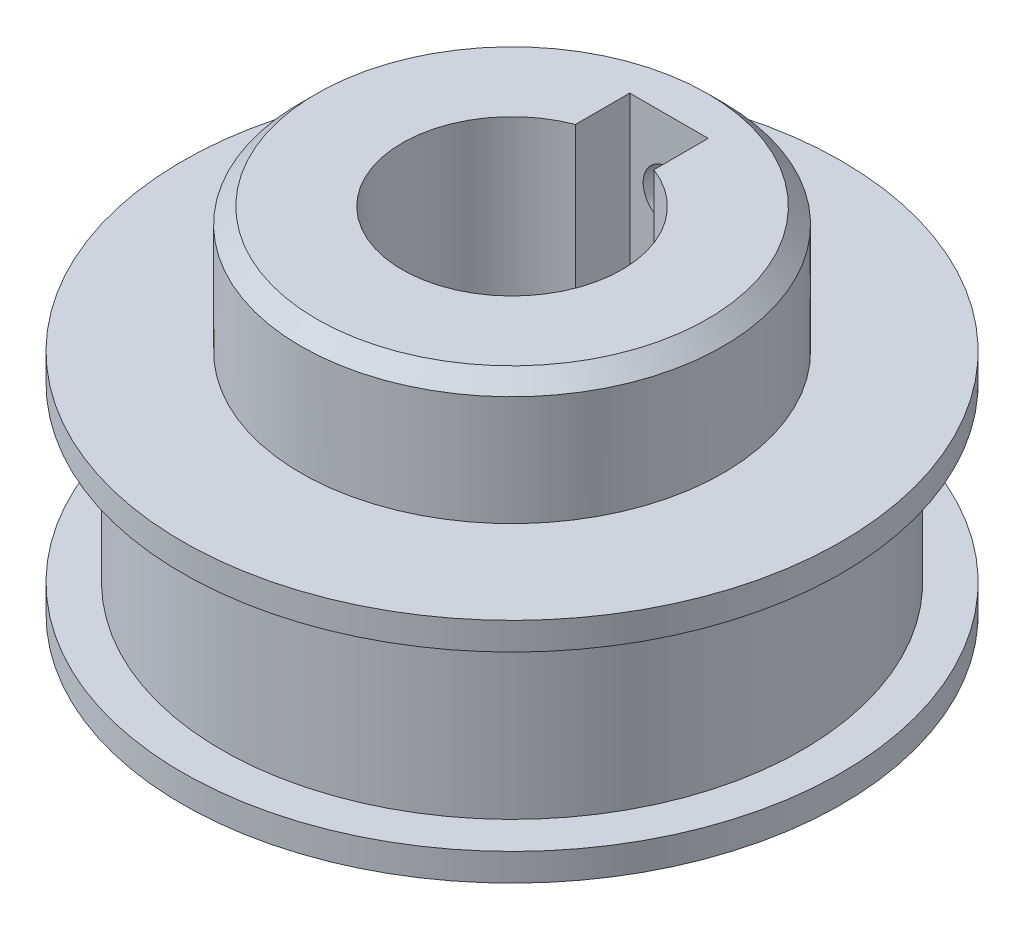
ISO-10303-21;
HEADER;
FILE_DESCRIPTION(('STEP AP214'),'2;1');
FILE_NAME('part.step','',(''),(''),'','','');
FILE_SCHEMA(('AUTOMOTIVE_DESIGN { 1 0 10303 214 1 1 1 1 }'));
ENDSEC;
DATA;
#1=APPLICATION_CONTEXT('core data for automotive mechanical design processes');
#2=APPLICATION_PROTOCOL_DEFINITION('international standard','automotive_design',2000,#1);
#3=PRODUCT_CONTEXT('',#1,'mechanical');
#4=PRODUCT('Part','Part','',(#3));
#5=PRODUCT_RELATED_PRODUCT_CATEGORY('part','',(#4));
#6=PRODUCT_DEFINITION_FORMATION('','',#4);
#7=PRODUCT_DEFINITION_CONTEXT('part definition',#1,'design');
#8=PRODUCT_DEFINITION('design','',#6,#7);
#9=PRODUCT_DEFINITION_SHAPE('','',#8);
#10=(LENGTH_UNIT() NAMED_UNIT(*) SI_UNIT(.MILLI.,.METRE.));
#11=(NAMED_UNIT(*) PLANE_ANGLE_UNIT() SI_UNIT($,.RADIAN.));
#12=(NAMED_UNIT(*) SI_UNIT($,.STERADIAN.) SOLID_ANGLE_UNIT());
#13=UNCERTAINTY_MEASURE_WITH_UNIT(LENGTH_MEASURE(1.E-05),#10,'distance_accuracy_value','');
#14=(GEOMETRIC_REPRESENTATION_CONTEXT(3) GLOBAL_UNCERTAINTY_ASSIGNED_CONTEXT((#13)) GLOBAL_UNIT_ASSIGNED_CONTEXT((#10,
#11,#12)) REPRESENTATION_CONTEXT('',''));
#15=CARTESIAN_POINT('',(0.,0.,0.));
#16=DIRECTION('',(0.,0.,1.));
#17=DIRECTION('',(1.,0.,0.));
#18=AXIS2_PLACEMENT_3D('',#15,#16,#17);
#19=CARTESIAN_POINT('',(0.,11.25,0.));
#20=DIRECTION('',(0.,1.,0.));
#21=DIRECTION('',(0.,0.,1.));
#22=AXIS2_PLACEMENT_3D('',#19,#20,#21);
#23=PLANE('',#22);
#24=DIRECTION('',(0.,0.,1.));
#25=VECTOR('',#24,1.);
#26=CARTESIAN_POINT('',(-2.5,11.25,-4.));
#27=LINE('',#26,#25);
#28=CARTESIAN_POINT('',(-2.5,11.25,-10.));
#29=VERTEX_POINT('',#28);
#30=CARTESIAN_POINT('',(-2.5,11.25,-6.53834841531101));
#31=VERTEX_POINT('',#30);
#32=EDGE_CURVE('E111',#29,#31,#27,.T.);
#33=ORIENTED_EDGE('',*,*,#32,.F.);
#34=DIRECTION('',(-1.,0.,0.));
#35=VECTOR('',#34,1.);
#36=CARTESIAN_POINT('',(2.5,11.25,-10.));
#37=LINE('',#36,#35);
#38=CARTESIAN_POINT('',(2.5,11.25,-10.));
#39=VERTEX_POINT('',#38);
#40=EDGE_CURVE('E108',#39,#29,#37,.T.);
#41=ORIENTED_EDGE('',*,*,#40,.F.);
#42=DIRECTION('',(0.,0.,-1.));
#43=VECTOR('',#42,1.);
#44=CARTESIAN_POINT('',(2.5,11.25,-4.));
#45=LINE('',#44,#43);
#46=CARTESIAN_POINT('',(2.5,11.25,-6.53834841531101));
#47=VERTEX_POINT('',#46);
#48=EDGE_CURVE('E85',#47,#39,#45,.T.);
#49=ORIENTED_EDGE('',*,*,#48,.F.);
#50=CARTESIAN_POINT('',(0.,11.25,0.));
#51=DIRECTION('',(0.,1.,0.));
#52=DIRECTION('',(0.,0.,1.));
#53=AXIS2_PLACEMENT_3D('',#50,#51,#52);
#54=CIRCLE('',#53,7.);
#55=EDGE_CURVE('E123',#31,#47,#54,.T.);
#56=ORIENTED_EDGE('',*,*,#55,.F.);
#57=EDGE_LOOP('',(#33,#41,#49,#56));
#58=FACE_BOUND('',#57,.T.);
#59=CARTESIAN_POINT('',(0.,11.25,0.));
#60=DIRECTION('',(0.,1.,0.));
#61=DIRECTION('',(0.,0.,1.));
#62=AXIS2_PLACEMENT_3D('',#59,#60,#61);
#63=CIRCLE('',#62,12.45);
#64=CARTESIAN_POINT('',(0.,11.25,12.45));
#65=VERTEX_POINT('',#64);
#66=EDGE_CURVE('E188',#65,#65,#63,.T.);
#67=ORIENTED_EDGE('',*,*,#66,.T.);
#68=EDGE_LOOP('',(#67));
#69=FACE_BOUND('',#68,.T.);
#70=ADVANCED_FACE('F40',(#58,#69),#23,.T.);
#71=CARTESIAN_POINT('',(0.,-12.375,0.));
#72=DIRECTION('',(0.,-1.,0.));
#73=DIRECTION('',(0.,0.,-1.));
#74=AXIS2_PLACEMENT_3D('',#71,#72,#73);
#75=CYLINDRICAL_SURFACE('',#74,13.45);
#76=CARTESIAN_POINT('',(0.,8.4,-13.45));
#77=CARTESIAN_POINT('',(0.0923092606846522,8.39999606989156,-13.4499987318262));
#78=CARTESIAN_POINT('',(0.184676546565116,8.39222752254949,-13.4490396601292));
#79=CARTESIAN_POINT('',(0.366841822033255,8.36135934683921,-13.4453059823572));
#80=CARTESIAN_POINT('',(0.456637010359747,8.33824362017226,-13.4425294699356));
#81=CARTESIAN_POINT('',(0.630994428152322,8.27737154568672,-13.4354737642154));
#82=CARTESIAN_POINT('',(0.715560099781557,8.23962494971325,-13.4311955720033));
#83=CARTESIAN_POINT('',(0.877140082819454,8.15058371541106,-13.4216125888811));
#84=CARTESIAN_POINT('',(0.954155707326011,8.09929143868824,-13.4163079769639));
#85=CARTESIAN_POINT('',(1.09887473843124,7.98432350451151,-13.4052331083348));
#86=CARTESIAN_POINT('',(1.16653227898811,7.92059030725544,-13.3994607638233));
#87=CARTESIAN_POINT('',(1.29021965720093,7.78267316407076,-13.3881178862387));
#88=CARTESIAN_POINT('',(1.3462489080705,7.7084886910672,-13.3825473633617));
#89=CARTESIAN_POINT('',(1.44525931032078,7.55147777239056,-13.3722182299544));
#90=CARTESIAN_POINT('',(1.48819762643743,7.4686241229816,-13.3674623066793));
#91=CARTESIAN_POINT('',(1.55953374744784,7.29681393267107,-13.3593282504242));
#92=CARTESIAN_POINT('',(1.58793208386536,7.20785761499358,-13.3559500670804));
#93=CARTESIAN_POINT('',(1.62924305851266,7.02684254400976,-13.3509738304528));
#94=CARTESIAN_POINT('',(1.64223302212707,6.93480168630368,-13.3493668912592));
#95=CARTESIAN_POINT('',(1.65259776008657,6.74983340414768,-13.3480878588677));
#96=CARTESIAN_POINT('',(1.64997314003763,6.65690601422117,-13.3484156906304));
#97=CARTESIAN_POINT('',(1.62924671453376,6.47334082873499,-13.3509610283831));
#98=CARTESIAN_POINT('',(1.61123000940919,6.3826932599305,-13.3531681438955));
#99=CARTESIAN_POINT('',(1.56036358203791,6.20571796726024,-13.3592071549006));
#100=CARTESIAN_POINT('',(1.52751356938961,6.11939032800538,-13.3630390822031));
#101=CARTESIAN_POINT('',(1.44782129743991,5.95324059148484,-13.3719077551923));
#102=CARTESIAN_POINT('',(1.40094197823018,5.8734364465625,-13.3769476848372));
#103=CARTESIAN_POINT('',(1.29454834829898,5.72279573680187,-13.387662006051));
#104=CARTESIAN_POINT('',(1.23503348084826,5.65195956731714,-13.3933364255707));
#105=CARTESIAN_POINT('',(1.10458615859966,5.52077157990349,-13.4047265640634));
#106=CARTESIAN_POINT('',(1.03358033713523,5.46049269247193,-13.4104423065102));
#107=CARTESIAN_POINT('',(0.882419530715335,5.35269795321998,-13.421235697483));
#108=CARTESIAN_POINT('',(0.802264525964526,5.30518212901474,-13.4263133446283));
#109=CARTESIAN_POINT('',(0.635024999510896,5.22426256591315,-13.4352614196214));
#110=CARTESIAN_POINT('',(0.547938289333149,5.19086330506102,-13.4391314642928));
#111=CARTESIAN_POINT('',(0.3693346923303,5.13918239287224,-13.4452247727249));
#112=CARTESIAN_POINT('',(0.277818005423388,5.12090006000337,-13.4474481107253));
#113=CARTESIAN_POINT('',(0.0935829703302501,5.10006629118723,-13.4499878579134));
#114=CARTESIAN_POINT('',(0.000876146276728533,5.09741437220646,-13.4503164475478));
#115=CARTESIAN_POINT('',(-0.183660609696694,5.10765166184763,-13.4490625385916));
#116=CARTESIAN_POINT('',(-0.275490559549179,5.12054055196202,-13.4474800791678));
#117=CARTESIAN_POINT('',(-0.455371019516503,5.16141012686836,-13.4425894893476));
#118=CARTESIAN_POINT('',(-0.543432556703835,5.18934298804758,-13.4392868284265));
#119=CARTESIAN_POINT('',(-0.713621209965722,5.25945793163178,-13.4313256660794));
#120=CARTESIAN_POINT('',(-0.795748131212371,5.301640481583,-13.4266671201659));
#121=CARTESIAN_POINT('',(-0.952185601351656,5.39930112738369,-13.4164833637743));
#122=CARTESIAN_POINT('',(-1.02645523001572,5.45484432614539,-13.4109539568387));
#123=CARTESIAN_POINT('',(-1.16465376419515,5.57755737276608,-13.3996603848827));
#124=CARTESIAN_POINT('',(-1.2285822747215,5.64472766453039,-13.3938962109055));
#125=CARTESIAN_POINT('',(-1.34463961437588,5.78923038063816,-13.3827452759908));
#126=CARTESIAN_POINT('',(-1.39670190188454,5.86661644582719,-13.377360754952));
#127=CARTESIAN_POINT('',(-1.48708947309349,6.0290932732003,-13.3676153586065));
#128=CARTESIAN_POINT('',(-1.52541502358073,6.11418388571093,-13.3632544634201));
#129=CARTESIAN_POINT('',(-1.58713309499605,6.2894383202972,-13.3560652169377));
#130=CARTESIAN_POINT('',(-1.61056334369739,6.37958869058734,-13.3532329964891));
#131=CARTESIAN_POINT('',(-1.64194730698151,6.56258116743755,-13.3494105895796));
#132=CARTESIAN_POINT('',(-1.64990171292012,6.65542315356641,-13.3484203208328));
#133=CARTESIAN_POINT('',(-1.65009582779569,6.84050149096557,-13.3483962729262));
#134=CARTESIAN_POINT('',(-1.64244007353199,6.93273774839408,-13.3493494788668));
#135=CARTESIAN_POINT('',(-1.61185233199219,7.11460212713943,-13.3530770204912));
#136=CARTESIAN_POINT('',(-1.58892034124114,7.20423024786299,-13.3558513565892));
#137=CARTESIAN_POINT('',(-1.52846338782943,7.37832168451034,-13.3629045779662));
#138=CARTESIAN_POINT('',(-1.49094326479907,7.46278670255674,-13.3671829642298));
#139=CARTESIAN_POINT('',(-1.40238541414801,7.62423855105335,-13.3767630641329));
#140=CARTESIAN_POINT('',(-1.35134754184961,7.70122530145313,-13.3820647887248));
#141=CARTESIAN_POINT('',(-1.23681455747847,7.8460698163772,-13.3931367411319));
#142=CARTESIAN_POINT('',(-1.17324151661805,7.91386575090879,-13.3989097601505));
#143=CARTESIAN_POINT('',(-1.03560482830966,8.03786788561699,-13.4102490819286));
#144=CARTESIAN_POINT('',(-0.961538707336214,8.09407134541484,-13.4158153355559));
#145=CARTESIAN_POINT('',(-0.804707912187814,8.19346753605082,-13.4261363991204));
#146=CARTESIAN_POINT('',(-0.721912336762905,8.23661180141906,-13.4308881586852));
#147=CARTESIAN_POINT('',(-0.550239848962248,8.30832314807712,-13.4390137556234));
#148=CARTESIAN_POINT('',(-0.461369690725895,8.33690612994305,-13.4423890952073));
#149=CARTESIAN_POINT('',(-0.310029334491708,8.37181241152802,-13.4465643492695));
#150=CARTESIAN_POINT('',(-0.248514914853924,8.38236764276486,-13.4478464692165));
#151=CARTESIAN_POINT('',(-0.124675817596508,8.39646273973653,-13.4495647199177));
#152=CARTESIAN_POINT('',(-0.0623511456574501,8.40000265462817,-13.4500008565998));
#153=CARTESIAN_POINT('',(0.,8.4,-13.45));
#154=B_SPLINE_CURVE_WITH_KNOTS('',3,(#76,#77,#78,#79,#80,#81,#82,#83,#84,#85,#86,#87,#88,#89,
#90,#91,#92,#93,#94,#95,#96,#97,#98,#99,#100,#101,#102,#103,#104,#105,#106,#107,#108,#109,#110,
#111,#112,#113,#114,#115,#116,#117,#118,#119,#120,#121,#122,#123,#124,#125,#126,#127,#128,#129,
#130,#131,#132,#133,#134,#135,#136,#137,#138,#139,#140,#141,#142,#143,#144,#145,#146,#147,#148,
#149,#150,#151,#152,#153),.UNSPECIFIED.,.T.,.F.,(4,2,2,2,2,2,2,2,2,2,2,2,2,2,2,2,2,2,2,2,2,2,2,
2,2,2,2,2,2,2,2,2,2,2,2,2,2,2,4),(0.,0.276700039848801,0.553690781475281,0.830497218348917,
1.10725542755036,1.38532535416116,1.66340930931717,1.94239366032399,2.2213678120454,
2.49893595553601,2.77649333371692,3.0525260004692,3.3285640715321,3.60533786155207,
3.88212384890976,4.16075232836323,4.4393814106739,4.7180988132492,4.99680364943228,
5.27371480831541,5.55062029202468,5.8266506661095,6.10269009790101,6.38010286050754,
6.65752621666219,6.93646895544387,7.21540627646803,7.49363424238483,7.7718497786754,
8.04820830450432,8.32456689319753,8.60083387771954,8.87710381919007,9.15514874581255,
9.43325932514204,9.71238972281186,9.99121465982896,10.1781155758501,10.3650151822392),.UNSPECIFIED.);
#155=CARTESIAN_POINT('',(0.,8.4,-13.45));
#156=VERTEX_POINT('',#155);
#157=EDGE_CURVE('E122',#156,#156,#154,.T.);
#158=ORIENTED_EDGE('',*,*,#157,.F.);
#159=EDGE_LOOP('',(#158));
#160=FACE_BOUND('',#159,.T.);
#161=CARTESIAN_POINT('',(0.,10.25,0.));
#162=DIRECTION('',(0.,1.,0.));
#163=DIRECTION('',(0.,0.,1.));
#164=AXIS2_PLACEMENT_3D('',#161,#162,#163);
#165=CIRCLE('',#164,13.45);
#166=CARTESIAN_POINT('',(0.,10.25,13.45));
#167=VERTEX_POINT('',#166);
#168=EDGE_CURVE('E191',#167,#167,#165,.F.);
#169=ORIENTED_EDGE('',*,*,#168,.T.);
#170=EDGE_LOOP('',(#169));
#171=FACE_BOUND('',#170,.T.);
#172=CARTESIAN_POINT('',(0.,3.25,0.));
#173=DIRECTION('',(0.,-1.,0.));
#174=DIRECTION('',(0.,0.,-1.));
#175=AXIS2_PLACEMENT_3D('',#172,#173,#174);
#176=CIRCLE('',#175,13.45);
#177=CARTESIAN_POINT('',(0.,3.25,-13.45));
#178=VERTEX_POINT('',#177);
#179=EDGE_CURVE('E197',#178,#178,#176,.T.);
#180=ORIENTED_EDGE('',*,*,#179,.F.);
#181=EDGE_LOOP('',(#180));
#182=FACE_BOUND('',#181,.T.);
#183=ADVANCED_FACE('F137',(#160,#171,#182),#75,.T.);
#184=CARTESIAN_POINT('',(13.45,3.25,0.));
#185=DIRECTION('',(0.,1.,0.));
#186=DIRECTION('',(0.,0.,1.));
#187=AXIS2_PLACEMENT_3D('',#184,#185,#186);
#188=PLANE('',#187);
#189=ORIENTED_EDGE('',*,*,#179,.T.);
#190=EDGE_LOOP('',(#189));
#191=FACE_BOUND('',#190,.T.);
#192=CARTESIAN_POINT('',(0.,3.25,0.));
#193=DIRECTION('',(0.,-1.,0.));
#194=DIRECTION('',(0.,0.,-1.));
#195=AXIS2_PLACEMENT_3D('',#192,#193,#194);
#196=CIRCLE('',#195,21.);
#197=CARTESIAN_POINT('',(0.,3.25,-21.));
#198=VERTEX_POINT('',#197);
#199=EDGE_CURVE('E202',#198,#198,#196,.T.);
#200=ORIENTED_EDGE('',*,*,#199,.F.);
#201=EDGE_LOOP('',(#200));
#202=FACE_BOUND('',#201,.T.);
#203=ADVANCED_FACE('F168',(#191,#202),#188,.T.);
#204=CARTESIAN_POINT('',(0.,-12.375,0.));
#205=DIRECTION('',(0.,-1.,0.));
#206=DIRECTION('',(0.,0.,-1.));
#207=AXIS2_PLACEMENT_3D('',#204,#205,#206);
#208=CYLINDRICAL_SURFACE('',#207,21.);
#209=ORIENTED_EDGE('',*,*,#199,.T.);
#210=EDGE_LOOP('',(#209));
#211=FACE_BOUND('',#210,.T.);
#212=CARTESIAN_POINT('',(0.,1.5,0.));
#213=DIRECTION('',(0.,-1.,0.));
#214=DIRECTION('',(0.,0.,-1.));
#215=AXIS2_PLACEMENT_3D('',#212,#213,#214);
#216=CIRCLE('',#215,21.);
#217=CARTESIAN_POINT('',(0.,1.5,-21.));
#218=VERTEX_POINT('',#217);
#219=EDGE_CURVE('E206',#218,#218,#216,.T.);
#220=ORIENTED_EDGE('',*,*,#219,.F.);
#221=EDGE_LOOP('',(#220));
#222=FACE_BOUND('',#221,.T.);
#223=ADVANCED_FACE('F165',(#211,#222),#208,.T.);
#224=CARTESIAN_POINT('',(21.,1.5,0.));
#225=DIRECTION('',(0.,-1.,0.));
#226=DIRECTION('',(0.,0.,-1.));
#227=AXIS2_PLACEMENT_3D('',#224,#225,#226);
#228=PLANE('',#227);
#229=ORIENTED_EDGE('',*,*,#219,.T.);
#230=EDGE_LOOP('',(#229));
#231=FACE_BOUND('',#230,.T.);
#232=CARTESIAN_POINT('',(0.,1.5,0.));
#233=DIRECTION('',(0.,-1.,0.));
#234=DIRECTION('',(0.,0.,-1.));
#235=AXIS2_PLACEMENT_3D('',#232,#233,#234);
#236=CIRCLE('',#235,18.5);
#237=CARTESIAN_POINT('',(0.,1.5,-18.5));
#238=VERTEX_POINT('',#237);
#239=EDGE_CURVE('E210',#238,#238,#236,.T.);
#240=ORIENTED_EDGE('',*,*,#239,.F.);
#241=EDGE_LOOP('',(#240));
#242=FACE_BOUND('',#241,.T.);
#243=ADVANCED_FACE('F161',(#231,#242),#228,.T.);
#244=CARTESIAN_POINT('',(0.,-12.375,0.));
#245=DIRECTION('',(0.,-1.,0.));
#246=DIRECTION('',(0.,0.,-1.));
#247=AXIS2_PLACEMENT_3D('',#244,#245,#246);
#248=CYLINDRICAL_SURFACE('',#247,18.5);
#249=ORIENTED_EDGE('',*,*,#239,.T.);
#250=EDGE_LOOP('',(#249));
#251=FACE_BOUND('',#250,.T.);
#252=CARTESIAN_POINT('',(0.,-9.5,0.));
#253=DIRECTION('',(0.,-1.,0.));
#254=DIRECTION('',(0.,0.,-1.));
#255=AXIS2_PLACEMENT_3D('',#252,#253,#254);
#256=CIRCLE('',#255,18.5);
#257=CARTESIAN_POINT('',(0.,-9.5,-18.5));
#258=VERTEX_POINT('',#257);
#259=EDGE_CURVE('E214',#258,#258,#256,.T.);
#260=ORIENTED_EDGE('',*,*,#259,.F.);
#261=EDGE_LOOP('',(#260));
#262=FACE_BOUND('',#261,.T.);
#263=ADVANCED_FACE('F157',(#251,#262),#248,.T.);
#264=CARTESIAN_POINT('',(18.5,-9.5,0.));
#265=DIRECTION('',(0.,1.,0.));
#266=DIRECTION('',(0.,0.,1.));
#267=AXIS2_PLACEMENT_3D('',#264,#265,#266);
#268=PLANE('',#267);
#269=ORIENTED_EDGE('',*,*,#259,.T.);
#270=EDGE_LOOP('',(#269));
#271=FACE_BOUND('',#270,.T.);
#272=CARTESIAN_POINT('',(0.,-9.5,0.));
#273=DIRECTION('',(0.,-1.,0.));
#274=DIRECTION('',(0.,0.,-1.));
#275=AXIS2_PLACEMENT_3D('',#272,#273,#274);
#276=CIRCLE('',#275,21.);
#277=CARTESIAN_POINT('',(0.,-9.5,-21.));
#278=VERTEX_POINT('',#277);
#279=EDGE_CURVE('E217',#278,#278,#276,.T.);
#280=ORIENTED_EDGE('',*,*,#279,.F.);
#281=EDGE_LOOP('',(#280));
#282=FACE_BOUND('',#281,.T.);
#283=ADVANCED_FACE('F153',(#271,#282),#268,.T.);
#284=CARTESIAN_POINT('',(0.,-12.375,0.));
#285=DIRECTION('',(0.,-1.,0.));
#286=DIRECTION('',(0.,0.,-1.));
#287=AXIS2_PLACEMENT_3D('',#284,#285,#286);
#288=CYLINDRICAL_SURFACE('',#287,21.);
#289=ORIENTED_EDGE('',*,*,#279,.T.);
#290=EDGE_LOOP('',(#289));
#291=FACE_BOUND('',#290,.T.);
#292=CARTESIAN_POINT('',(0.,-11.25,0.));
#293=DIRECTION('',(0.,-1.,0.));
#294=DIRECTION('',(0.,0.,-1.));
#295=AXIS2_PLACEMENT_3D('',#292,#293,#294);
#296=CIRCLE('',#295,21.);
#297=CARTESIAN_POINT('',(0.,-11.25,-21.));
#298=VERTEX_POINT('',#297);
#299=EDGE_CURVE('E135',#298,#298,#296,.T.);
#300=ORIENTED_EDGE('',*,*,#299,.F.);
#301=EDGE_LOOP('',(#300));
#302=FACE_BOUND('',#301,.T.);
#303=ADVANCED_FACE('F150',(#291,#302),#288,.T.);
#304=CARTESIAN_POINT('',(21.,-11.25,0.));
#305=DIRECTION('',(0.,-1.,0.));
#306=DIRECTION('',(0.,0.,-1.));
#307=AXIS2_PLACEMENT_3D('',#304,#305,#306);
#308=PLANE('',#307);
#309=DIRECTION('',(0.,0.,1.));
#310=VECTOR('',#309,1.);
#311=CARTESIAN_POINT('',(-2.5,-11.25,-4.));
#312=LINE('',#311,#310);
#313=CARTESIAN_POINT('',(-2.5,-11.25,-10.));
#314=VERTEX_POINT('',#313);
#315=CARTESIAN_POINT('',(-2.5,-11.25,-6.53834841531101));
#316=VERTEX_POINT('',#315);
#317=EDGE_CURVE('E105',#314,#316,#312,.T.);
#318=ORIENTED_EDGE('',*,*,#317,.T.);
#319=CARTESIAN_POINT('',(0.,-11.25,0.));
#320=DIRECTION('',(0.,1.,0.));
#321=DIRECTION('',(0.,0.,1.));
#322=AXIS2_PLACEMENT_3D('',#319,#320,#321);
#323=CIRCLE('',#322,7.);
#324=CARTESIAN_POINT('',(2.5,-11.25,-6.53834841531101));
#325=VERTEX_POINT('',#324);
#326=EDGE_CURVE('E103',#316,#325,#323,.T.);
#327=ORIENTED_EDGE('',*,*,#326,.T.);
#328=DIRECTION('',(0.,0.,-1.));
#329=VECTOR('',#328,1.);
#330=CARTESIAN_POINT('',(2.5,-11.25,-4.));
#331=LINE('',#330,#329);
#332=CARTESIAN_POINT('',(2.5,-11.25,-10.));
#333=VERTEX_POINT('',#332);
#334=EDGE_CURVE('E58',#325,#333,#331,.T.);
#335=ORIENTED_EDGE('',*,*,#334,.T.);
#336=DIRECTION('',(-1.,0.,0.));
#337=VECTOR('',#336,1.);
#338=CARTESIAN_POINT('',(2.5,-11.25,-10.));
#339=LINE('',#338,#337);
#340=EDGE_CURVE('E91',#333,#314,#339,.T.);
#341=ORIENTED_EDGE('',*,*,#340,.T.);
#342=EDGE_LOOP('',(#318,#327,#335,#341));
#343=FACE_BOUND('',#342,.T.);
#344=ORIENTED_EDGE('',*,*,#299,.T.);
#345=EDGE_LOOP('',(#344));
#346=FACE_BOUND('',#345,.T.);
#347=ADVANCED_FACE('F100',(#343,#346),#308,.T.);
#348=CARTESIAN_POINT('',(0.,10.25,0.));
#349=DIRECTION('',(0.,-1.,0.));
#350=DIRECTION('',(0.,0.,-1.));
#351=AXIS2_PLACEMENT_3D('',#348,#349,#350);
#352=CONICAL_SURFACE('',#351,13.45,0.785398163397452);
#353=ORIENTED_EDGE('',*,*,#66,.F.);
#354=EDGE_LOOP('',(#353));
#355=FACE_BOUND('',#354,.T.);
#356=ORIENTED_EDGE('',*,*,#168,.F.);
#357=EDGE_LOOP('',(#356));
#358=FACE_BOUND('',#357,.T.);
#359=ADVANCED_FACE('F43',(#355,#358),#352,.T.);
#360=CARTESIAN_POINT('',(0.,6.75,-21.));
#361=DIRECTION('',(0.,0.,1.));
#362=DIRECTION('',(1.,0.,0.));
#363=AXIS2_PLACEMENT_3D('',#360,#361,#362);
#364=CYLINDRICAL_SURFACE('',#363,1.65);
#365=CARTESIAN_POINT('',(0.,6.75,-10.));
#366=DIRECTION('',(0.,0.,-1.));
#367=DIRECTION('',(-1.,0.,0.));
#368=AXIS2_PLACEMENT_3D('',#365,#366,#367);
#369=CIRCLE('',#368,1.65);
#370=CARTESIAN_POINT('',(-1.65,6.75,-10.));
#371=VERTEX_POINT('',#370);
#372=EDGE_CURVE('E45',#371,#371,#369,.F.);
#373=ORIENTED_EDGE('',*,*,#372,.T.);
#374=EDGE_LOOP('',(#373));
#375=FACE_BOUND('',#374,.T.);
#376=ORIENTED_EDGE('',*,*,#157,.T.);
#377=EDGE_LOOP('',(#376));
#378=FACE_BOUND('',#377,.T.);
#379=ADVANCED_FACE('F140',(#375,#378),#364,.F.);
#380=CARTESIAN_POINT('',(0.,-11.25,0.));
#381=DIRECTION('',(0.,1.,0.));
#382=DIRECTION('',(0.,0.,1.));
#383=AXIS2_PLACEMENT_3D('',#380,#381,#382);
#384=CYLINDRICAL_SURFACE('',#383,7.);
#385=ORIENTED_EDGE('',*,*,#326,.F.);
#386=DIRECTION('',(0.,1.,0.));
#387=VECTOR('',#386,1.);
#388=CARTESIAN_POINT('',(-2.5,-11.25,-6.53834841531101));
#389=LINE('',#388,#387);
#390=EDGE_CURVE('E11',#316,#31,#389,.T.);
#391=ORIENTED_EDGE('',*,*,#390,.T.);
#392=ORIENTED_EDGE('',*,*,#55,.T.);
#393=DIRECTION('',(0.,1.,0.));
#394=VECTOR('',#393,1.);
#395=CARTESIAN_POINT('',(2.5,-11.25,-6.53834841531101));
#396=LINE('',#395,#394);
#397=EDGE_CURVE('E51',#47,#325,#396,.F.);
#398=ORIENTED_EDGE('',*,*,#397,.T.);
#399=EDGE_LOOP('',(#385,#391,#392,#398));
#400=FACE_BOUND('',#399,.T.);
#401=ADVANCED_FACE('F145',(#400),#384,.F.);
#402=CARTESIAN_POINT('',(2.5,-11.25,-10.));
#403=DIRECTION('',(0.,0.,-1.));
#404=DIRECTION('',(-1.,0.,0.));
#405=AXIS2_PLACEMENT_3D('',#402,#403,#404);
#406=PLANE('',#405);
#407=ORIENTED_EDGE('',*,*,#40,.T.);
#408=DIRECTION('',(0.,1.,0.));
#409=VECTOR('',#408,1.);
#410=CARTESIAN_POINT('',(-2.5,-11.25,-10.));
#411=LINE('',#410,#409);
#412=EDGE_CURVE('E90',#314,#29,#411,.T.);
#413=ORIENTED_EDGE('',*,*,#412,.F.);
#414=ORIENTED_EDGE('',*,*,#340,.F.);
#415=DIRECTION('',(0.,1.,0.));
#416=VECTOR('',#415,1.);
#417=CARTESIAN_POINT('',(2.5,-11.25,-10.));
#418=LINE('',#417,#416);
#419=EDGE_CURVE('E81',#333,#39,#418,.T.);
#420=ORIENTED_EDGE('',*,*,#419,.T.);
#421=EDGE_LOOP('',(#407,#413,#414,#420));
#422=FACE_BOUND('',#421,.T.);
#423=ORIENTED_EDGE('',*,*,#372,.F.);
#424=EDGE_LOOP('',(#423));
#425=FACE_BOUND('',#424,.T.);
#426=ADVANCED_FACE('F94',(#422,#425),#406,.F.);
#427=CARTESIAN_POINT('',(-2.5,-11.25,-4.));
#428=DIRECTION('',(-1.,0.,0.));
#429=DIRECTION('',(0.,0.,1.));
#430=AXIS2_PLACEMENT_3D('',#427,#428,#429);
#431=PLANE('',#430);
#432=ORIENTED_EDGE('',*,*,#317,.F.);
#433=ORIENTED_EDGE('',*,*,#412,.T.);
#434=ORIENTED_EDGE('',*,*,#32,.T.);
#435=ORIENTED_EDGE('',*,*,#390,.F.);
#436=EDGE_LOOP('',(#432,#433,#434,#435));
#437=FACE_BOUND('',#436,.T.);
#438=ADVANCED_FACE('F230',(#437),#431,.F.);
#439=CARTESIAN_POINT('',(2.5,-11.25,-4.));
#440=DIRECTION('',(1.,0.,0.));
#441=DIRECTION('',(0.,0.,-1.));
#442=AXIS2_PLACEMENT_3D('',#439,#440,#441);
#443=PLANE('',#442);
#444=ORIENTED_EDGE('',*,*,#48,.T.);
#445=ORIENTED_EDGE('',*,*,#419,.F.);
#446=ORIENTED_EDGE('',*,*,#334,.F.);
#447=ORIENTED_EDGE('',*,*,#397,.F.);
#448=EDGE_LOOP('',(#444,#445,#446,#447));
#449=FACE_BOUND('',#448,.T.);
#450=ADVANCED_FACE('F83',(#449),#443,.F.);
#451=CLOSED_SHELL('',(#70,#183,#203,#223,#243,#263,#283,#303,#347,#359,#379,#401,#426,#438,#450));
#452=MANIFOLD_SOLID_BREP('B2',#451);
#453=ADVANCED_BREP_SHAPE_REPRESENTATION('',(#18,#452),#14);
#454=SHAPE_DEFINITION_REPRESENTATION(#9,#453);
ENDSEC;
END-ISO-10303-21;
